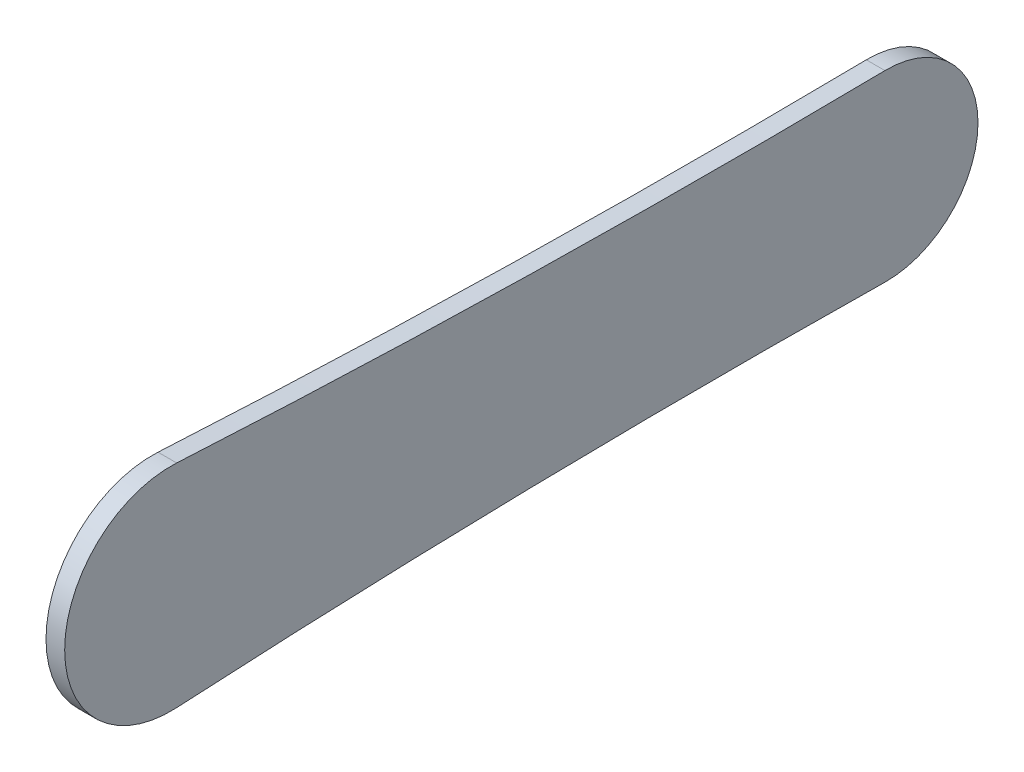
ISO-10303-21;
HEADER;
FILE_DESCRIPTION(('STEP AP214'),'2;1');
FILE_NAME('part.step','',(''),(''),'','','');
FILE_SCHEMA(('AUTOMOTIVE_DESIGN { 1 0 10303 214 1 1 1 1 }'));
ENDSEC;
DATA;
#1=APPLICATION_CONTEXT('core data for automotive mechanical design processes');
#2=APPLICATION_PROTOCOL_DEFINITION('international standard','automotive_design',2000,#1);
#3=PRODUCT_CONTEXT('',#1,'mechanical');
#4=PRODUCT('Part','Part','',(#3));
#5=PRODUCT_RELATED_PRODUCT_CATEGORY('part','',(#4));
#6=PRODUCT_DEFINITION_FORMATION('','',#4);
#7=PRODUCT_DEFINITION_CONTEXT('part definition',#1,'design');
#8=PRODUCT_DEFINITION('design','',#6,#7);
#9=PRODUCT_DEFINITION_SHAPE('','',#8);
#10=(LENGTH_UNIT() NAMED_UNIT(*) SI_UNIT(.MILLI.,.METRE.));
#11=(NAMED_UNIT(*) PLANE_ANGLE_UNIT() SI_UNIT($,.RADIAN.));
#12=(NAMED_UNIT(*) SI_UNIT($,.STERADIAN.) SOLID_ANGLE_UNIT());
#13=UNCERTAINTY_MEASURE_WITH_UNIT(LENGTH_MEASURE(1.E-05),#10,'distance_accuracy_value','');
#14=(GEOMETRIC_REPRESENTATION_CONTEXT(3) GLOBAL_UNCERTAINTY_ASSIGNED_CONTEXT((#13)) GLOBAL_UNIT_ASSIGNED_CONTEXT((#10,
#11,#12)) REPRESENTATION_CONTEXT('',''));
#15=CARTESIAN_POINT('',(0.,0.,0.));
#16=DIRECTION('',(0.,0.,1.));
#17=DIRECTION('',(1.,0.,0.));
#18=AXIS2_PLACEMENT_3D('',#15,#16,#17);
#19=CARTESIAN_POINT('',(3.,13.1458432660022,23.1316108608223));
#20=DIRECTION('',(-1.,0.,0.));
#21=DIRECTION('',(0.,0.,1.));
#22=AXIS2_PLACEMENT_3D('',#19,#20,#21);
#23=CYLINDRICAL_SURFACE('',#22,17.0548935572075);
#24=CARTESIAN_POINT('',(0.,13.1458432660022,23.1316108608223));
#25=DIRECTION('',(1.,0.,0.));
#26=DIRECTION('',(0.,0.,-1.));
#27=AXIS2_PLACEMENT_3D('',#24,#25,#26);
#28=CIRCLE('',#27,17.0548935572075);
#29=CARTESIAN_POINT('',(0.,30.174322804446,22.1827806038882));
#30=VERTEX_POINT('',#29);
#31=CARTESIAN_POINT('',(0.,-3.88263627244179,22.1827806038874));
#32=VERTEX_POINT('',#31);
#33=EDGE_CURVE('E95',#30,#32,#28,.T.);
#34=ORIENTED_EDGE('',*,*,#33,.T.);
#35=DIRECTION('',(-1.,0.,0.));
#36=VECTOR('',#35,1.);
#37=CARTESIAN_POINT('',(3.,-3.88263627244179,22.1827806038874));
#38=LINE('',#37,#36);
#39=CARTESIAN_POINT('',(3.,-3.88263627244179,22.1827806038874));
#40=VERTEX_POINT('',#39);
#41=EDGE_CURVE('E11',#40,#32,#38,.T.);
#42=ORIENTED_EDGE('',*,*,#41,.F.);
#43=CARTESIAN_POINT('',(3.,13.1458432660022,23.1316108608223));
#44=DIRECTION('',(1.,0.,0.));
#45=DIRECTION('',(0.,0.,-1.));
#46=AXIS2_PLACEMENT_3D('',#43,#44,#45);
#47=CIRCLE('',#46,17.0548935572075);
#48=CARTESIAN_POINT('',(3.,30.174322804446,22.1827806038882));
#49=VERTEX_POINT('',#48);
#50=EDGE_CURVE('E83',#49,#40,#47,.T.);
#51=ORIENTED_EDGE('',*,*,#50,.F.);
#52=DIRECTION('',(-1.,0.,0.));
#53=VECTOR('',#52,1.);
#54=CARTESIAN_POINT('',(3.,30.174322804446,22.1827806038882));
#55=LINE('',#54,#53);
#56=EDGE_CURVE('E91',#49,#30,#55,.T.);
#57=ORIENTED_EDGE('',*,*,#56,.T.);
#58=EDGE_LOOP('',(#34,#42,#51,#57));
#59=FACE_BOUND('',#58,.T.);
#60=ADVANCED_FACE('F32',(#59),#23,.T.);
#61=CARTESIAN_POINT('',(3.,-1607.39532000793,-67.1652641391776));
#62=DIRECTION('',(-1.,0.,0.));
#63=DIRECTION('',(0.,0.,1.));
#64=AXIS2_PLACEMENT_3D('',#61,#62,#63);
#65=CYLINDRICAL_SURFACE('',#64,1606.);
#66=CARTESIAN_POINT('',(0.,-1607.39532000793,-67.1652641391776));
#67=DIRECTION('',(-1.,0.,0.));
#68=DIRECTION('',(0.,0.,-1.));
#69=AXIS2_PLACEMENT_3D('',#66,#67,#68);
#70=CIRCLE('',#69,1606.);
#71=CARTESIAN_POINT('',(0.,-1.58188215140307,-91.6438833690084));
#72=VERTEX_POINT('',#71);
#73=EDGE_CURVE('E87',#32,#72,#70,.T.);
#74=ORIENTED_EDGE('',*,*,#73,.T.);
#75=DIRECTION('',(-1.,0.,0.));
#76=VECTOR('',#75,1.);
#77=CARTESIAN_POINT('',(3.,-1.58188215140307,-91.6438833690084));
#78=LINE('',#77,#76);
#79=CARTESIAN_POINT('',(3.,-1.58188215140307,-91.6438833690084));
#80=VERTEX_POINT('',#79);
#81=EDGE_CURVE('E40',#80,#72,#78,.T.);
#82=ORIENTED_EDGE('',*,*,#81,.F.);
#83=CARTESIAN_POINT('',(3.,-1607.39532000793,-67.1652641391776));
#84=DIRECTION('',(-1.,0.,0.));
#85=DIRECTION('',(0.,0.,-1.));
#86=AXIS2_PLACEMENT_3D('',#83,#84,#85);
#87=CIRCLE('',#86,1606.);
#88=EDGE_CURVE('E78',#40,#80,#87,.T.);
#89=ORIENTED_EDGE('',*,*,#88,.F.);
#90=ORIENTED_EDGE('',*,*,#41,.T.);
#91=EDGE_LOOP('',(#74,#82,#89,#90));
#92=FACE_BOUND('',#91,.T.);
#93=ADVANCED_FACE('F86',(#92),#65,.F.);
#94=CARTESIAN_POINT('',(3.,13.1458432660022,-91.8683891391777));
#95=DIRECTION('',(-1.,0.,0.));
#96=DIRECTION('',(0.,0.,1.));
#97=AXIS2_PLACEMENT_3D('',#94,#95,#96);
#98=CYLINDRICAL_SURFACE('',#97,14.7294364729722);
#99=CARTESIAN_POINT('',(0.,13.1458432660022,-91.8683891391777));
#100=DIRECTION('',(1.,0.,0.));
#101=DIRECTION('',(0.,0.,-1.));
#102=AXIS2_PLACEMENT_3D('',#99,#100,#101);
#103=CIRCLE('',#102,14.7294364729722);
#104=CARTESIAN_POINT('',(0.,27.8735686834073,-91.6438833690083));
#105=VERTEX_POINT('',#104);
#106=EDGE_CURVE('E65',#72,#105,#103,.T.);
#107=ORIENTED_EDGE('',*,*,#106,.T.);
#108=DIRECTION('',(-1.,0.,0.));
#109=VECTOR('',#108,1.);
#110=CARTESIAN_POINT('',(3.,27.8735686834073,-91.6438833690083));
#111=LINE('',#110,#109);
#112=CARTESIAN_POINT('',(3.,27.8735686834073,-91.6438833690083));
#113=VERTEX_POINT('',#112);
#114=EDGE_CURVE('E88',#113,#105,#111,.T.);
#115=ORIENTED_EDGE('',*,*,#114,.F.);
#116=CARTESIAN_POINT('',(3.,13.1458432660022,-91.8683891391777));
#117=DIRECTION('',(1.,0.,0.));
#118=DIRECTION('',(0.,0.,-1.));
#119=AXIS2_PLACEMENT_3D('',#116,#117,#118);
#120=CIRCLE('',#119,14.7294364729722);
#121=EDGE_CURVE('E81',#80,#113,#120,.T.);
#122=ORIENTED_EDGE('',*,*,#121,.F.);
#123=ORIENTED_EDGE('',*,*,#81,.T.);
#124=EDGE_LOOP('',(#107,#115,#122,#123));
#125=FACE_BOUND('',#124,.T.);
#126=ADVANCED_FACE('F89',(#125),#98,.T.);
#127=CARTESIAN_POINT('',(3.,1633.68700653994,-67.1652641391776));
#128=DIRECTION('',(-1.,0.,0.));
#129=DIRECTION('',(0.,0.,1.));
#130=AXIS2_PLACEMENT_3D('',#127,#128,#129);
#131=CYLINDRICAL_SURFACE('',#130,1606.);
#132=CARTESIAN_POINT('',(0.,1633.68700653994,-67.1652641391776));
#133=DIRECTION('',(-1.,0.,0.));
#134=DIRECTION('',(0.,0.,-1.));
#135=AXIS2_PLACEMENT_3D('',#132,#133,#134);
#136=CIRCLE('',#135,1606.);
#137=EDGE_CURVE('E71',#105,#30,#136,.T.);
#138=ORIENTED_EDGE('',*,*,#137,.T.);
#139=ORIENTED_EDGE('',*,*,#56,.F.);
#140=CARTESIAN_POINT('',(3.,1633.68700653994,-67.1652641391776));
#141=DIRECTION('',(-1.,0.,0.));
#142=DIRECTION('',(0.,0.,-1.));
#143=AXIS2_PLACEMENT_3D('',#140,#141,#142);
#144=CIRCLE('',#143,1606.);
#145=EDGE_CURVE('E48',#113,#49,#144,.T.);
#146=ORIENTED_EDGE('',*,*,#145,.F.);
#147=ORIENTED_EDGE('',*,*,#114,.T.);
#148=EDGE_LOOP('',(#138,#139,#146,#147));
#149=FACE_BOUND('',#148,.T.);
#150=ADVANCED_FACE('F102',(#149),#131,.F.);
#151=CARTESIAN_POINT('',(3.,-797.124738370965,-22.0168266391776));
#152=DIRECTION('',(1.,0.,0.));
#153=DIRECTION('',(0.,0.,-1.));
#154=AXIS2_PLACEMENT_3D('',#151,#152,#153);
#155=PLANE('',#154);
#156=ORIENTED_EDGE('',*,*,#50,.T.);
#157=ORIENTED_EDGE('',*,*,#88,.T.);
#158=ORIENTED_EDGE('',*,*,#121,.T.);
#159=ORIENTED_EDGE('',*,*,#145,.T.);
#160=EDGE_LOOP('',(#156,#157,#158,#159));
#161=FACE_BOUND('',#160,.T.);
#162=ADVANCED_FACE('F79',(#161),#155,.T.);
#163=CARTESIAN_POINT('',(0.,-797.124738370965,-22.0168266391776));
#164=DIRECTION('',(1.,0.,0.));
#165=DIRECTION('',(0.,0.,-1.));
#166=AXIS2_PLACEMENT_3D('',#163,#164,#165);
#167=PLANE('',#166);
#168=ORIENTED_EDGE('',*,*,#33,.F.);
#169=ORIENTED_EDGE('',*,*,#137,.F.);
#170=ORIENTED_EDGE('',*,*,#106,.F.);
#171=ORIENTED_EDGE('',*,*,#73,.F.);
#172=EDGE_LOOP('',(#168,#169,#170,#171));
#173=FACE_BOUND('',#172,.T.);
#174=ADVANCED_FACE('F105',(#173),#167,.F.);
#175=CLOSED_SHELL('',(#60,#93,#126,#150,#162,#174));
#176=MANIFOLD_SOLID_BREP('B2',#175);
#177=ADVANCED_BREP_SHAPE_REPRESENTATION('',(#18,#176),#14);
#178=SHAPE_DEFINITION_REPRESENTATION(#9,#177);
ENDSEC;
END-ISO-10303-21;
